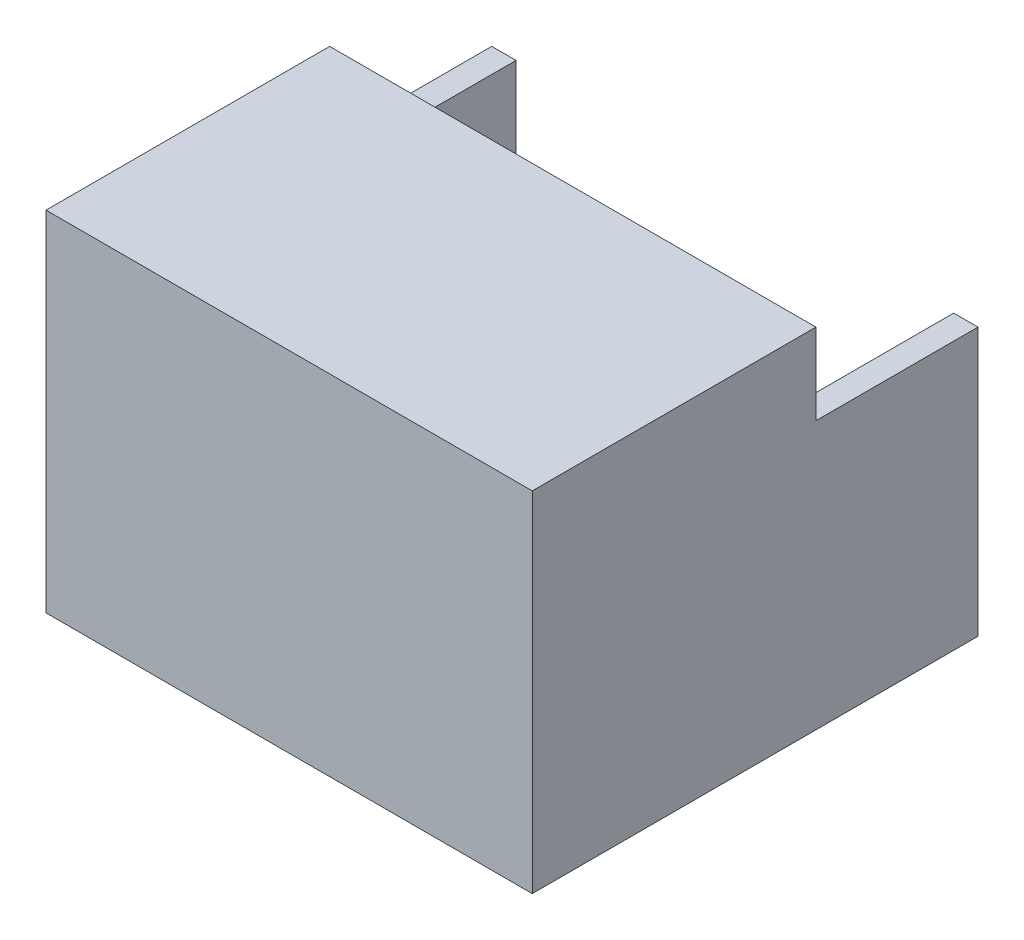
ISO-10303-21;
HEADER;
FILE_DESCRIPTION(('STEP AP214'),'2;1');
FILE_NAME('part.step','',(''),(''),'','','');
FILE_SCHEMA(('AUTOMOTIVE_DESIGN { 1 0 10303 214 1 1 1 1 }'));
ENDSEC;
DATA;
#1=APPLICATION_CONTEXT('core data for automotive mechanical design processes');
#2=APPLICATION_PROTOCOL_DEFINITION('international standard','automotive_design',2000,#1);
#3=PRODUCT_CONTEXT('',#1,'mechanical');
#4=PRODUCT('Part','Part','',(#3));
#5=PRODUCT_RELATED_PRODUCT_CATEGORY('part','',(#4));
#6=PRODUCT_DEFINITION_FORMATION('','',#4);
#7=PRODUCT_DEFINITION_CONTEXT('part definition',#1,'design');
#8=PRODUCT_DEFINITION('design','',#6,#7);
#9=PRODUCT_DEFINITION_SHAPE('','',#8);
#10=(LENGTH_UNIT() NAMED_UNIT(*) SI_UNIT(.MILLI.,.METRE.));
#11=(NAMED_UNIT(*) PLANE_ANGLE_UNIT() SI_UNIT($,.RADIAN.));
#12=(NAMED_UNIT(*) SI_UNIT($,.STERADIAN.) SOLID_ANGLE_UNIT());
#13=UNCERTAINTY_MEASURE_WITH_UNIT(LENGTH_MEASURE(1.E-05),#10,'distance_accuracy_value','');
#14=(GEOMETRIC_REPRESENTATION_CONTEXT(3) GLOBAL_UNCERTAINTY_ASSIGNED_CONTEXT((#13)) GLOBAL_UNIT_ASSIGNED_CONTEXT((#10,
#11,#12)) REPRESENTATION_CONTEXT('',''));
#15=CARTESIAN_POINT('',(0.,0.,0.));
#16=DIRECTION('',(0.,0.,1.));
#17=DIRECTION('',(1.,0.,0.));
#18=AXIS2_PLACEMENT_3D('',#15,#16,#17);
#19=CARTESIAN_POINT('',(3.,3.,110.));
#20=DIRECTION('',(0.,1.,0.));
#21=DIRECTION('',(0.,0.,1.));
#22=AXIS2_PLACEMENT_3D('',#19,#20,#21);
#23=PLANE('',#22);
#24=DIRECTION('',(0.,0.,-1.));
#25=VECTOR('',#24,1.);
#26=CARTESIAN_POINT('',(3.,3.,110.));
#27=LINE('',#26,#25);
#28=CARTESIAN_POINT('',(3.,3.,50.));
#29=VERTEX_POINT('',#28);
#30=CARTESIAN_POINT('',(3.,3.,0.));
#31=VERTEX_POINT('',#30);
#32=EDGE_CURVE('E150',#29,#31,#27,.T.);
#33=ORIENTED_EDGE('',*,*,#32,.F.);
#34=DIRECTION('',(1.,0.,0.));
#35=VECTOR('',#34,1.);
#36=CARTESIAN_POINT('',(3.,3.,50.));
#37=LINE('',#36,#35);
#38=CARTESIAN_POINT('',(57.,3.,50.));
#39=VERTEX_POINT('',#38);
#40=EDGE_CURVE('E55',#29,#39,#37,.T.);
#41=ORIENTED_EDGE('',*,*,#40,.T.);
#42=DIRECTION('',(0.,0.,-1.));
#43=VECTOR('',#42,1.);
#44=CARTESIAN_POINT('',(57.,3.,110.));
#45=LINE('',#44,#43);
#46=CARTESIAN_POINT('',(57.,3.,0.));
#47=VERTEX_POINT('',#46);
#48=EDGE_CURVE('E154',#39,#47,#45,.T.);
#49=ORIENTED_EDGE('',*,*,#48,.T.);
#50=DIRECTION('',(1.,0.,0.));
#51=VECTOR('',#50,1.);
#52=CARTESIAN_POINT('',(3.,3.,0.));
#53=LINE('',#52,#51);
#54=EDGE_CURVE('E235',#31,#47,#53,.T.);
#55=ORIENTED_EDGE('',*,*,#54,.F.);
#56=EDGE_LOOP('',(#33,#41,#49,#55));
#57=FACE_BOUND('',#56,.T.);
#58=ADVANCED_FACE('F39',(#57),#23,.T.);
#59=CARTESIAN_POINT('',(57.,3.,110.));
#60=DIRECTION('',(-1.,0.,0.));
#61=DIRECTION('',(0.,0.,1.));
#62=AXIS2_PLACEMENT_3D('',#59,#60,#61);
#63=PLANE('',#62);
#64=ORIENTED_EDGE('',*,*,#48,.F.);
#65=DIRECTION('',(0.,1.,0.));
#66=VECTOR('',#65,1.);
#67=CARTESIAN_POINT('',(57.,3.,50.));
#68=LINE('',#67,#66);
#69=CARTESIAN_POINT('',(57.,40.037715622259,50.));
#70=VERTEX_POINT('',#69);
#71=EDGE_CURVE('E144',#39,#70,#68,.T.);
#72=ORIENTED_EDGE('',*,*,#71,.T.);
#73=DIRECTION('',(0.,0.,-1.));
#74=VECTOR('',#73,1.);
#75=CARTESIAN_POINT('',(57.,40.037715622259,110.));
#76=LINE('',#75,#74);
#77=CARTESIAN_POINT('',(57.,40.037715622259,20.));
#78=VERTEX_POINT('',#77);
#79=EDGE_CURVE('E142',#70,#78,#76,.T.);
#80=ORIENTED_EDGE('',*,*,#79,.T.);
#81=DIRECTION('',(0.,1.,0.));
#82=VECTOR('',#81,1.);
#83=CARTESIAN_POINT('',(57.,3.,20.));
#84=LINE('',#83,#82);
#85=CARTESIAN_POINT('',(57.,33.0377156222591,20.));
#86=VERTEX_POINT('',#85);
#87=EDGE_CURVE('E231',#86,#78,#84,.T.);
#88=ORIENTED_EDGE('',*,*,#87,.F.);
#89=DIRECTION('',(0.,0.,-1.));
#90=VECTOR('',#89,1.);
#91=CARTESIAN_POINT('',(57.,33.0377156222591,110.));
#92=LINE('',#91,#90);
#93=CARTESIAN_POINT('',(57.,33.0377156222591,0.));
#94=VERTEX_POINT('',#93);
#95=EDGE_CURVE('E221',#86,#94,#92,.T.);
#96=ORIENTED_EDGE('',*,*,#95,.T.);
#97=DIRECTION('',(0.,1.,0.));
#98=VECTOR('',#97,1.);
#99=CARTESIAN_POINT('',(57.,3.,0.));
#100=LINE('',#99,#98);
#101=EDGE_CURVE('E238',#47,#94,#100,.T.);
#102=ORIENTED_EDGE('',*,*,#101,.F.);
#103=EDGE_LOOP('',(#64,#72,#80,#88,#96,#102));
#104=FACE_BOUND('',#103,.T.);
#105=ADVANCED_FACE('F247',(#104),#63,.T.);
#106=CARTESIAN_POINT('',(3.,40.037715622259,110.));
#107=DIRECTION('',(0.,-1.,0.));
#108=DIRECTION('',(0.,0.,-1.));
#109=AXIS2_PLACEMENT_3D('',#106,#107,#108);
#110=PLANE('',#109);
#111=ORIENTED_EDGE('',*,*,#79,.F.);
#112=DIRECTION('',(-1.,0.,0.));
#113=VECTOR('',#112,1.);
#114=CARTESIAN_POINT('',(3.,40.037715622259,50.));
#115=LINE('',#114,#113);
#116=CARTESIAN_POINT('',(3.,40.037715622259,50.));
#117=VERTEX_POINT('',#116);
#118=EDGE_CURVE('E129',#70,#117,#115,.T.);
#119=ORIENTED_EDGE('',*,*,#118,.T.);
#120=DIRECTION('',(0.,0.,-1.));
#121=VECTOR('',#120,1.);
#122=CARTESIAN_POINT('',(3.,40.037715622259,110.));
#123=LINE('',#122,#121);
#124=CARTESIAN_POINT('',(3.,40.037715622259,20.));
#125=VERTEX_POINT('',#124);
#126=EDGE_CURVE('E140',#117,#125,#123,.T.);
#127=ORIENTED_EDGE('',*,*,#126,.T.);
#128=DIRECTION('',(-1.,0.,0.));
#129=VECTOR('',#128,1.);
#130=CARTESIAN_POINT('',(3.00000000000001,40.037715622259,20.));
#131=LINE('',#130,#129);
#132=EDGE_CURVE('E228',#78,#125,#131,.T.);
#133=ORIENTED_EDGE('',*,*,#132,.F.);
#134=EDGE_LOOP('',(#111,#119,#127,#133));
#135=FACE_BOUND('',#134,.T.);
#136=ADVANCED_FACE('F138',(#135),#110,.T.);
#137=CARTESIAN_POINT('',(3.,3.,110.));
#138=DIRECTION('',(1.,0.,0.));
#139=DIRECTION('',(0.,0.,-1.));
#140=AXIS2_PLACEMENT_3D('',#137,#138,#139);
#141=PLANE('',#140);
#142=ORIENTED_EDGE('',*,*,#126,.F.);
#143=DIRECTION('',(0.,-1.,0.));
#144=VECTOR('',#143,1.);
#145=CARTESIAN_POINT('',(3.,3.,50.));
#146=LINE('',#145,#144);
#147=EDGE_CURVE('E126',#117,#29,#146,.T.);
#148=ORIENTED_EDGE('',*,*,#147,.T.);
#149=ORIENTED_EDGE('',*,*,#32,.T.);
#150=DIRECTION('',(0.,-1.,0.));
#151=VECTOR('',#150,1.);
#152=CARTESIAN_POINT('',(3.,3.,0.));
#153=LINE('',#152,#151);
#154=CARTESIAN_POINT('',(3.,33.0377156222591,0.));
#155=VERTEX_POINT('',#154);
#156=EDGE_CURVE('E156',#155,#31,#153,.T.);
#157=ORIENTED_EDGE('',*,*,#156,.F.);
#158=DIRECTION('',(0.,0.,1.));
#159=VECTOR('',#158,1.);
#160=CARTESIAN_POINT('',(3.,33.0377156222591,110.));
#161=LINE('',#160,#159);
#162=CARTESIAN_POINT('',(3.,33.0377156222591,20.));
#163=VERTEX_POINT('',#162);
#164=EDGE_CURVE('E48',#155,#163,#161,.T.);
#165=ORIENTED_EDGE('',*,*,#164,.T.);
#166=DIRECTION('',(0.,-1.,0.));
#167=VECTOR('',#166,1.);
#168=CARTESIAN_POINT('',(3.,3.,20.));
#169=LINE('',#168,#167);
#170=EDGE_CURVE('E11',#125,#163,#169,.T.);
#171=ORIENTED_EDGE('',*,*,#170,.F.);
#172=EDGE_LOOP('',(#142,#148,#149,#157,#165,#171));
#173=FACE_BOUND('',#172,.T.);
#174=ADVANCED_FACE('F147',(#173),#141,.T.);
#175=CARTESIAN_POINT('',(0.,0.,0.));
#176=DIRECTION('',(0.,0.,-1.));
#177=DIRECTION('',(-1.,0.,0.));
#178=AXIS2_PLACEMENT_3D('',#175,#176,#177);
#179=PLANE('',#178);
#180=DIRECTION('',(0.,-1.,0.));
#181=VECTOR('',#180,1.);
#182=CARTESIAN_POINT('',(0.,0.,0.));
#183=LINE('',#182,#181);
#184=CARTESIAN_POINT('',(0.,33.0377156222591,0.));
#185=VERTEX_POINT('',#184);
#186=CARTESIAN_POINT('',(0.,0.,0.));
#187=VERTEX_POINT('',#186);
#188=EDGE_CURVE('E162',#185,#187,#183,.T.);
#189=ORIENTED_EDGE('',*,*,#188,.F.);
#190=DIRECTION('',(-1.,0.,0.));
#191=VECTOR('',#190,1.);
#192=CARTESIAN_POINT('',(0.,33.0377156222591,0.));
#193=LINE('',#192,#191);
#194=EDGE_CURVE('E192',#155,#185,#193,.T.);
#195=ORIENTED_EDGE('',*,*,#194,.F.);
#196=ORIENTED_EDGE('',*,*,#156,.T.);
#197=ORIENTED_EDGE('',*,*,#54,.T.);
#198=ORIENTED_EDGE('',*,*,#101,.T.);
#199=CARTESIAN_POINT('',(60.,33.0377156222591,0.));
#200=VERTEX_POINT('',#199);
#201=EDGE_CURVE('E202',#200,#94,#193,.T.);
#202=ORIENTED_EDGE('',*,*,#201,.F.);
#203=DIRECTION('',(0.,1.,0.));
#204=VECTOR('',#203,1.);
#205=CARTESIAN_POINT('',(60.,0.,0.));
#206=LINE('',#205,#204);
#207=CARTESIAN_POINT('',(60.,0.,0.));
#208=VERTEX_POINT('',#207);
#209=EDGE_CURVE('E170',#208,#200,#206,.T.);
#210=ORIENTED_EDGE('',*,*,#209,.F.);
#211=DIRECTION('',(1.,0.,0.));
#212=VECTOR('',#211,1.);
#213=CARTESIAN_POINT('',(0.,0.,0.));
#214=LINE('',#213,#212);
#215=EDGE_CURVE('E166',#187,#208,#214,.T.);
#216=ORIENTED_EDGE('',*,*,#215,.F.);
#217=EDGE_LOOP('',(#189,#195,#196,#197,#198,#202,#210,#216));
#218=FACE_BOUND('',#217,.T.);
#219=ADVANCED_FACE('F197',(#218),#179,.T.);
#220=CARTESIAN_POINT('',(0.,0.,110.));
#221=DIRECTION('',(1.,0.,0.));
#222=DIRECTION('',(0.,0.,-1.));
#223=AXIS2_PLACEMENT_3D('',#220,#221,#222);
#224=PLANE('',#223);
#225=DIRECTION('',(0.,0.,-1.));
#226=VECTOR('',#225,1.);
#227=CARTESIAN_POINT('',(0.,43.037715622259,110.));
#228=LINE('',#227,#226);
#229=CARTESIAN_POINT('',(0.,43.037715622259,55.));
#230=VERTEX_POINT('',#229);
#231=CARTESIAN_POINT('',(0.,43.037715622259,20.));
#232=VERTEX_POINT('',#231);
#233=EDGE_CURVE('E174',#230,#232,#228,.T.);
#234=ORIENTED_EDGE('',*,*,#233,.T.);
#235=DIRECTION('',(0.,1.,0.));
#236=VECTOR('',#235,1.);
#237=CARTESIAN_POINT('',(0.,33.0377156222591,20.));
#238=LINE('',#237,#236);
#239=CARTESIAN_POINT('',(0.,33.0377156222591,20.));
#240=VERTEX_POINT('',#239);
#241=EDGE_CURVE('E207',#240,#232,#238,.T.);
#242=ORIENTED_EDGE('',*,*,#241,.F.);
#243=DIRECTION('',(0.,0.,1.));
#244=VECTOR('',#243,1.);
#245=CARTESIAN_POINT('',(0.,33.0377156222591,0.));
#246=LINE('',#245,#244);
#247=EDGE_CURVE('E215',#185,#240,#246,.T.);
#248=ORIENTED_EDGE('',*,*,#247,.F.);
#249=ORIENTED_EDGE('',*,*,#188,.T.);
#250=DIRECTION('',(0.,0.,-1.));
#251=VECTOR('',#250,1.);
#252=CARTESIAN_POINT('',(0.,0.,110.));
#253=LINE('',#252,#251);
#254=CARTESIAN_POINT('',(0.,0.,55.));
#255=VERTEX_POINT('',#254);
#256=EDGE_CURVE('E183',#255,#187,#253,.T.);
#257=ORIENTED_EDGE('',*,*,#256,.F.);
#258=DIRECTION('',(0.,1.,0.));
#259=VECTOR('',#258,1.);
#260=CARTESIAN_POINT('',(0.,-26.962284377741,55.));
#261=LINE('',#260,#259);
#262=EDGE_CURVE('E265',#255,#230,#261,.T.);
#263=ORIENTED_EDGE('',*,*,#262,.T.);
#264=EDGE_LOOP('',(#234,#242,#248,#249,#257,#263));
#265=FACE_BOUND('',#264,.T.);
#266=ADVANCED_FACE('F41',(#265),#224,.F.);
#267=CARTESIAN_POINT('',(0.,0.,110.));
#268=DIRECTION('',(0.,1.,0.));
#269=DIRECTION('',(0.,0.,1.));
#270=AXIS2_PLACEMENT_3D('',#267,#268,#269);
#271=PLANE('',#270);
#272=ORIENTED_EDGE('',*,*,#256,.T.);
#273=ORIENTED_EDGE('',*,*,#215,.T.);
#274=DIRECTION('',(0.,0.,-1.));
#275=VECTOR('',#274,1.);
#276=CARTESIAN_POINT('',(60.,0.,110.));
#277=LINE('',#276,#275);
#278=CARTESIAN_POINT('',(60.,0.,55.));
#279=VERTEX_POINT('',#278);
#280=EDGE_CURVE('E180',#279,#208,#277,.T.);
#281=ORIENTED_EDGE('',*,*,#280,.F.);
#282=DIRECTION('',(-1.,0.,0.));
#283=VECTOR('',#282,1.);
#284=CARTESIAN_POINT('',(0.,0.,55.));
#285=LINE('',#284,#283);
#286=EDGE_CURVE('E216',#279,#255,#285,.T.);
#287=ORIENTED_EDGE('',*,*,#286,.T.);
#288=EDGE_LOOP('',(#272,#273,#281,#287));
#289=FACE_BOUND('',#288,.T.);
#290=ADVANCED_FACE('F295',(#289),#271,.F.);
#291=CARTESIAN_POINT('',(60.,0.,110.));
#292=DIRECTION('',(-1.,0.,0.));
#293=DIRECTION('',(0.,0.,1.));
#294=AXIS2_PLACEMENT_3D('',#291,#292,#293);
#295=PLANE('',#294);
#296=ORIENTED_EDGE('',*,*,#280,.T.);
#297=ORIENTED_EDGE('',*,*,#209,.T.);
#298=DIRECTION('',(0.,0.,-1.));
#299=VECTOR('',#298,1.);
#300=CARTESIAN_POINT('',(60.,33.0377156222591,0.));
#301=LINE('',#300,#299);
#302=CARTESIAN_POINT('',(60.,33.0377156222591,20.));
#303=VERTEX_POINT('',#302);
#304=EDGE_CURVE('E203',#303,#200,#301,.T.);
#305=ORIENTED_EDGE('',*,*,#304,.F.);
#306=DIRECTION('',(0.,1.,0.));
#307=VECTOR('',#306,1.);
#308=CARTESIAN_POINT('',(60.,33.0377156222591,20.));
#309=LINE('',#308,#307);
#310=CARTESIAN_POINT('',(60.,43.037715622259,20.));
#311=VERTEX_POINT('',#310);
#312=EDGE_CURVE('E217',#303,#311,#309,.T.);
#313=ORIENTED_EDGE('',*,*,#312,.T.);
#314=DIRECTION('',(0.,0.,-1.));
#315=VECTOR('',#314,1.);
#316=CARTESIAN_POINT('',(60.,43.037715622259,110.));
#317=LINE('',#316,#315);
#318=CARTESIAN_POINT('',(60.,43.037715622259,55.));
#319=VERTEX_POINT('',#318);
#320=EDGE_CURVE('E177',#319,#311,#317,.T.);
#321=ORIENTED_EDGE('',*,*,#320,.F.);
#322=DIRECTION('',(0.,1.,0.));
#323=VECTOR('',#322,1.);
#324=CARTESIAN_POINT('',(60.,-26.962284377741,55.));
#325=LINE('',#324,#323);
#326=EDGE_CURVE('E63',#279,#319,#325,.T.);
#327=ORIENTED_EDGE('',*,*,#326,.F.);
#328=EDGE_LOOP('',(#296,#297,#305,#313,#321,#327));
#329=FACE_BOUND('',#328,.T.);
#330=ADVANCED_FACE('F292',(#329),#295,.F.);
#331=CARTESIAN_POINT('',(0.,43.037715622259,110.));
#332=DIRECTION('',(0.,-1.,0.));
#333=DIRECTION('',(0.,0.,-1.));
#334=AXIS2_PLACEMENT_3D('',#331,#332,#333);
#335=PLANE('',#334);
#336=ORIENTED_EDGE('',*,*,#320,.T.);
#337=DIRECTION('',(1.,0.,0.));
#338=VECTOR('',#337,1.);
#339=CARTESIAN_POINT('',(0.,43.037715622259,20.));
#340=LINE('',#339,#338);
#341=EDGE_CURVE('E211',#232,#311,#340,.T.);
#342=ORIENTED_EDGE('',*,*,#341,.F.);
#343=ORIENTED_EDGE('',*,*,#233,.F.);
#344=DIRECTION('',(-1.,0.,0.));
#345=VECTOR('',#344,1.);
#346=CARTESIAN_POINT('',(0.,43.037715622259,55.));
#347=LINE('',#346,#345);
#348=EDGE_CURVE('E268',#319,#230,#347,.T.);
#349=ORIENTED_EDGE('',*,*,#348,.F.);
#350=EDGE_LOOP('',(#336,#342,#343,#349));
#351=FACE_BOUND('',#350,.T.);
#352=ADVANCED_FACE('F289',(#351),#335,.F.);
#353=CARTESIAN_POINT('',(0.,33.0377156222591,0.));
#354=DIRECTION('',(0.,1.,0.));
#355=DIRECTION('',(0.,0.,1.));
#356=AXIS2_PLACEMENT_3D('',#353,#354,#355);
#357=PLANE('',#356);
#358=DIRECTION('',(1.,0.,0.));
#359=VECTOR('',#358,1.);
#360=CARTESIAN_POINT('',(0.,33.0377156222591,20.));
#361=LINE('',#360,#359);
#362=EDGE_CURVE('E252',#86,#303,#361,.T.);
#363=ORIENTED_EDGE('',*,*,#362,.T.);
#364=ORIENTED_EDGE('',*,*,#304,.T.);
#365=ORIENTED_EDGE('',*,*,#201,.T.);
#366=ORIENTED_EDGE('',*,*,#95,.F.);
#367=EDGE_LOOP('',(#363,#364,#365,#366));
#368=FACE_BOUND('',#367,.T.);
#369=ADVANCED_FACE('F251',(#368),#357,.T.);
#370=CARTESIAN_POINT('',(0.,33.0377156222591,20.));
#371=DIRECTION('',(0.,0.,1.));
#372=DIRECTION('',(1.,0.,0.));
#373=AXIS2_PLACEMENT_3D('',#370,#371,#372);
#374=PLANE('',#373);
#375=ORIENTED_EDGE('',*,*,#87,.T.);
#376=ORIENTED_EDGE('',*,*,#132,.T.);
#377=ORIENTED_EDGE('',*,*,#170,.T.);
#378=EDGE_CURVE('E194',#240,#163,#361,.T.);
#379=ORIENTED_EDGE('',*,*,#378,.F.);
#380=ORIENTED_EDGE('',*,*,#241,.T.);
#381=ORIENTED_EDGE('',*,*,#341,.T.);
#382=ORIENTED_EDGE('',*,*,#312,.F.);
#383=ORIENTED_EDGE('',*,*,#362,.F.);
#384=EDGE_LOOP('',(#375,#376,#377,#379,#380,#381,#382,#383));
#385=FACE_BOUND('',#384,.T.);
#386=ADVANCED_FACE('F255',(#385),#374,.F.);
#387=ORIENTED_EDGE('',*,*,#194,.T.);
#388=ORIENTED_EDGE('',*,*,#247,.T.);
#389=ORIENTED_EDGE('',*,*,#378,.T.);
#390=ORIENTED_EDGE('',*,*,#164,.F.);
#391=EDGE_LOOP('',(#387,#388,#389,#390));
#392=FACE_BOUND('',#391,.T.);
#393=ADVANCED_FACE('F190',(#392),#357,.T.);
#394=CARTESIAN_POINT('',(0.,-26.962284377741,55.));
#395=DIRECTION('',(0.,0.,-1.));
#396=DIRECTION('',(-1.,0.,0.));
#397=AXIS2_PLACEMENT_3D('',#394,#395,#396);
#398=PLANE('',#397);
#399=ORIENTED_EDGE('',*,*,#326,.T.);
#400=ORIENTED_EDGE('',*,*,#348,.T.);
#401=ORIENTED_EDGE('',*,*,#262,.F.);
#402=ORIENTED_EDGE('',*,*,#286,.F.);
#403=EDGE_LOOP('',(#399,#400,#401,#402));
#404=FACE_BOUND('',#403,.T.);
#405=ADVANCED_FACE('F309',(#404),#398,.F.);
#406=CARTESIAN_POINT('',(0.,0.,50.));
#407=DIRECTION('',(0.,0.,1.));
#408=DIRECTION('',(1.,0.,0.));
#409=AXIS2_PLACEMENT_3D('',#406,#407,#408);
#410=PLANE('',#409);
#411=ORIENTED_EDGE('',*,*,#40,.F.);
#412=ORIENTED_EDGE('',*,*,#147,.F.);
#413=ORIENTED_EDGE('',*,*,#118,.F.);
#414=ORIENTED_EDGE('',*,*,#71,.F.);
#415=EDGE_LOOP('',(#411,#412,#413,#414));
#416=FACE_BOUND('',#415,.T.);
#417=ADVANCED_FACE('F128',(#416),#410,.F.);
#418=CLOSED_SHELL('',(#58,#105,#136,#174,#219,#266,#290,#330,#352,#369,#386,#393,#405,#417));
#419=MANIFOLD_SOLID_BREP('B2',#418);
#420=ADVANCED_BREP_SHAPE_REPRESENTATION('',(#18,#419),#14);
#421=SHAPE_DEFINITION_REPRESENTATION(#9,#420);
ENDSEC;
END-ISO-10303-21;
